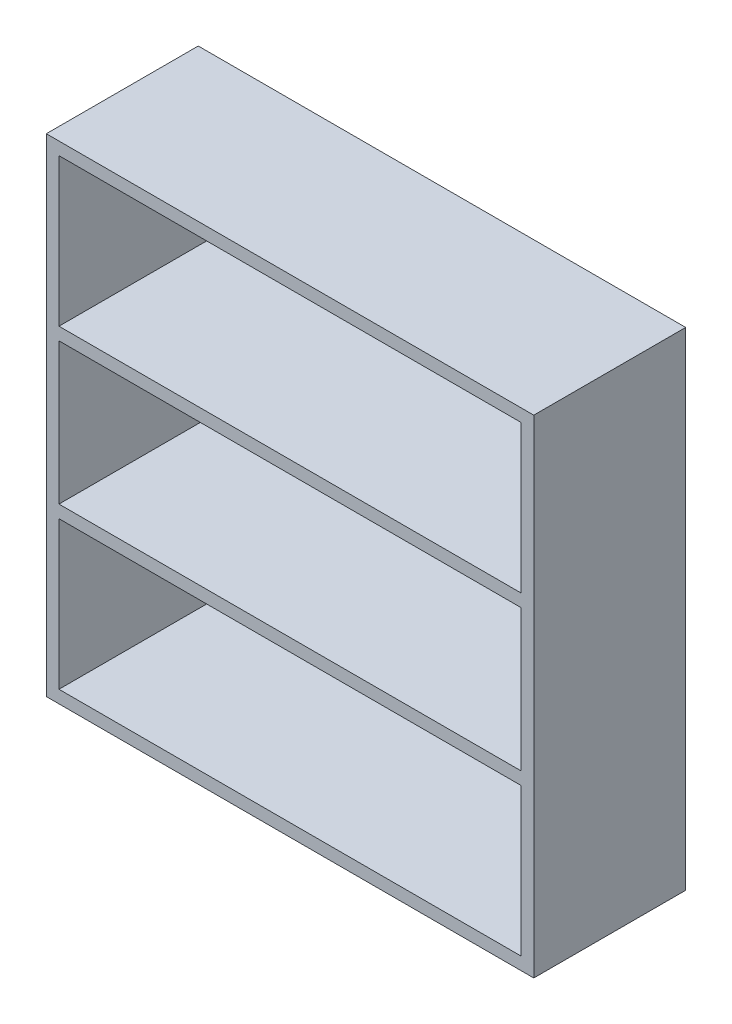
ISO-10303-21;
HEADER;
FILE_DESCRIPTION(('STEP AP214'),'2;1');
FILE_NAME('part.step','',(''),(''),'','','');
FILE_SCHEMA(('AUTOMOTIVE_DESIGN { 1 0 10303 214 1 1 1 1 }'));
ENDSEC;
DATA;
#1=APPLICATION_CONTEXT('core data for automotive mechanical design processes');
#2=APPLICATION_PROTOCOL_DEFINITION('international standard','automotive_design',2000,#1);
#3=PRODUCT_CONTEXT('',#1,'mechanical');
#4=PRODUCT('Part','Part','',(#3));
#5=PRODUCT_RELATED_PRODUCT_CATEGORY('part','',(#4));
#6=PRODUCT_DEFINITION_FORMATION('','',#4);
#7=PRODUCT_DEFINITION_CONTEXT('part definition',#1,'design');
#8=PRODUCT_DEFINITION('design','',#6,#7);
#9=PRODUCT_DEFINITION_SHAPE('','',#8);
#10=(LENGTH_UNIT() NAMED_UNIT(*) SI_UNIT(.MILLI.,.METRE.));
#11=(NAMED_UNIT(*) PLANE_ANGLE_UNIT() SI_UNIT($,.RADIAN.));
#12=(NAMED_UNIT(*) SI_UNIT($,.STERADIAN.) SOLID_ANGLE_UNIT());
#13=UNCERTAINTY_MEASURE_WITH_UNIT(LENGTH_MEASURE(1.E-05),#10,'distance_accuracy_value','');
#14=(GEOMETRIC_REPRESENTATION_CONTEXT(3) GLOBAL_UNCERTAINTY_ASSIGNED_CONTEXT((#13)) GLOBAL_UNIT_ASSIGNED_CONTEXT((#10,
#11,#12)) REPRESENTATION_CONTEXT('',''));
#15=CARTESIAN_POINT('',(0.,0.,0.));
#16=DIRECTION('',(0.,0.,1.));
#17=DIRECTION('',(1.,0.,0.));
#18=AXIS2_PLACEMENT_3D('',#15,#16,#17);
#19=CARTESIAN_POINT('',(977.9,1955.8,-304.8));
#20=DIRECTION('',(-1.,0.,0.));
#21=DIRECTION('',(0.,0.,1.));
#22=AXIS2_PLACEMENT_3D('',#19,#20,#21);
#23=PLANE('',#22);
#24=DIRECTION('',(0.,0.,-1.));
#25=VECTOR('',#24,1.);
#26=CARTESIAN_POINT('',(977.9,0.,-304.8));
#27=LINE('',#26,#25);
#28=CARTESIAN_POINT('',(977.9,0.,304.8));
#29=VERTEX_POINT('',#28);
#30=CARTESIAN_POINT('',(977.9,0.,-304.8));
#31=VERTEX_POINT('',#30);
#32=EDGE_CURVE('E182',#29,#31,#27,.T.);
#33=ORIENTED_EDGE('',*,*,#32,.T.);
#34=DIRECTION('',(0.,-1.,0.));
#35=VECTOR('',#34,1.);
#36=CARTESIAN_POINT('',(977.9,1955.8,-304.8));
#37=LINE('',#36,#35);
#38=CARTESIAN_POINT('',(977.9,1955.8,-304.8));
#39=VERTEX_POINT('',#38);
#40=EDGE_CURVE('E11',#39,#31,#37,.T.);
#41=ORIENTED_EDGE('',*,*,#40,.F.);
#42=DIRECTION('',(0.,0.,-1.));
#43=VECTOR('',#42,1.);
#44=CARTESIAN_POINT('',(977.9,1955.8,-304.8));
#45=LINE('',#44,#43);
#46=CARTESIAN_POINT('',(977.9,1955.8,304.8));
#47=VERTEX_POINT('',#46);
#48=EDGE_CURVE('E247',#47,#39,#45,.T.);
#49=ORIENTED_EDGE('',*,*,#48,.F.);
#50=DIRECTION('',(0.,-1.,0.));
#51=VECTOR('',#50,1.);
#52=CARTESIAN_POINT('',(977.9,1955.8,304.8));
#53=LINE('',#52,#51);
#54=EDGE_CURVE('E257',#47,#29,#53,.T.);
#55=ORIENTED_EDGE('',*,*,#54,.T.);
#56=EDGE_LOOP('',(#33,#41,#49,#55));
#57=FACE_BOUND('',#56,.T.);
#58=ADVANCED_FACE('F32',(#57),#23,.F.);
#59=CARTESIAN_POINT('',(-977.9,1955.8,-304.8));
#60=DIRECTION('',(0.,0.,1.));
#61=DIRECTION('',(1.,0.,0.));
#62=AXIS2_PLACEMENT_3D('',#59,#60,#61);
#63=PLANE('',#62);
#64=DIRECTION('',(-1.,0.,0.));
#65=VECTOR('',#64,1.);
#66=CARTESIAN_POINT('',(-927.099999999999,643.466666666667,-304.8));
#67=LINE('',#66,#65);
#68=CARTESIAN_POINT('',(927.1,643.466666666667,-304.8));
#69=VERTEX_POINT('',#68);
#70=CARTESIAN_POINT('',(-927.099999999999,643.466666666667,-304.8));
#71=VERTEX_POINT('',#70);
#72=EDGE_CURVE('E156',#69,#71,#67,.T.);
#73=ORIENTED_EDGE('',*,*,#72,.T.);
#74=DIRECTION('',(0.,-1.,0.));
#75=VECTOR('',#74,1.);
#76=CARTESIAN_POINT('',(-927.099999999999,643.466666666667,-304.8));
#77=LINE('',#76,#75);
#78=CARTESIAN_POINT('',(-927.1,50.8,-304.8));
#79=VERTEX_POINT('',#78);
#80=EDGE_CURVE('E148',#71,#79,#77,.T.);
#81=ORIENTED_EDGE('',*,*,#80,.T.);
#82=DIRECTION('',(1.,0.,0.));
#83=VECTOR('',#82,1.);
#84=CARTESIAN_POINT('',(-927.1,50.8,-304.8));
#85=LINE('',#84,#83);
#86=CARTESIAN_POINT('',(927.1,50.8,-304.8));
#87=VERTEX_POINT('',#86);
#88=EDGE_CURVE('E159',#79,#87,#85,.T.);
#89=ORIENTED_EDGE('',*,*,#88,.T.);
#90=DIRECTION('',(0.,1.,0.));
#91=VECTOR('',#90,1.);
#92=CARTESIAN_POINT('',(927.1,50.8,-304.8));
#93=LINE('',#92,#91);
#94=EDGE_CURVE('E46',#87,#69,#93,.T.);
#95=ORIENTED_EDGE('',*,*,#94,.T.);
#96=EDGE_LOOP('',(#73,#81,#89,#95));
#97=FACE_BOUND('',#96,.T.);
#98=DIRECTION('',(1.,0.,0.));
#99=VECTOR('',#98,1.);
#100=CARTESIAN_POINT('',(-927.1,1312.33333333333,-304.8));
#101=LINE('',#100,#99);
#102=CARTESIAN_POINT('',(-927.1,1312.33333333333,-304.8));
#103=VERTEX_POINT('',#102);
#104=CARTESIAN_POINT('',(927.1,1312.33333333333,-304.8));
#105=VERTEX_POINT('',#104);
#106=EDGE_CURVE('E194',#103,#105,#101,.T.);
#107=ORIENTED_EDGE('',*,*,#106,.T.);
#108=DIRECTION('',(0.,1.,0.));
#109=VECTOR('',#108,1.);
#110=CARTESIAN_POINT('',(927.1,1312.33333333333,-304.8));
#111=LINE('',#110,#109);
#112=CARTESIAN_POINT('',(927.1,1905.,-304.8));
#113=VERTEX_POINT('',#112);
#114=EDGE_CURVE('E186',#105,#113,#111,.T.);
#115=ORIENTED_EDGE('',*,*,#114,.T.);
#116=DIRECTION('',(-1.,0.,0.));
#117=VECTOR('',#116,1.);
#118=CARTESIAN_POINT('',(927.1,1905.,-304.8));
#119=LINE('',#118,#117);
#120=CARTESIAN_POINT('',(-927.1,1905.,-304.8));
#121=VERTEX_POINT('',#120);
#122=EDGE_CURVE('E189',#113,#121,#119,.T.);
#123=ORIENTED_EDGE('',*,*,#122,.T.);
#124=DIRECTION('',(0.,-1.,0.));
#125=VECTOR('',#124,1.);
#126=CARTESIAN_POINT('',(-927.1,1905.,-304.8));
#127=LINE('',#126,#125);
#128=EDGE_CURVE('E54',#121,#103,#127,.T.);
#129=ORIENTED_EDGE('',*,*,#128,.T.);
#130=EDGE_LOOP('',(#107,#115,#123,#129));
#131=FACE_BOUND('',#130,.T.);
#132=DIRECTION('',(-1.,0.,0.));
#133=VECTOR('',#132,1.);
#134=CARTESIAN_POINT('',(-927.1,1261.53333333333,-304.8));
#135=LINE('',#134,#133);
#136=CARTESIAN_POINT('',(927.1,1261.53333333333,-304.8));
#137=VERTEX_POINT('',#136);
#138=CARTESIAN_POINT('',(-927.1,1261.53333333333,-304.8));
#139=VERTEX_POINT('',#138);
#140=EDGE_CURVE('E226',#137,#139,#135,.T.);
#141=ORIENTED_EDGE('',*,*,#140,.T.);
#142=DIRECTION('',(0.,-1.,0.));
#143=VECTOR('',#142,1.);
#144=CARTESIAN_POINT('',(-927.1,1261.53333333333,-304.8));
#145=LINE('',#144,#143);
#146=CARTESIAN_POINT('',(-927.099999999999,694.266666666667,-304.8));
#147=VERTEX_POINT('',#146);
#148=EDGE_CURVE('E216',#139,#147,#145,.T.);
#149=ORIENTED_EDGE('',*,*,#148,.T.);
#150=DIRECTION('',(1.,0.,0.));
#151=VECTOR('',#150,1.);
#152=CARTESIAN_POINT('',(-927.099999999999,694.266666666667,-304.8));
#153=LINE('',#152,#151);
#154=CARTESIAN_POINT('',(927.1,694.266666666667,-304.8));
#155=VERTEX_POINT('',#154);
#156=EDGE_CURVE('E219',#147,#155,#153,.T.);
#157=ORIENTED_EDGE('',*,*,#156,.T.);
#158=DIRECTION('',(0.,1.,0.));
#159=VECTOR('',#158,1.);
#160=CARTESIAN_POINT('',(927.1,694.266666666667,-304.8));
#161=LINE('',#160,#159);
#162=EDGE_CURVE('E223',#155,#137,#161,.T.);
#163=ORIENTED_EDGE('',*,*,#162,.T.);
#164=EDGE_LOOP('',(#141,#149,#157,#163));
#165=FACE_BOUND('',#164,.T.);
#166=DIRECTION('',(-1.,0.,0.));
#167=VECTOR('',#166,1.);
#168=CARTESIAN_POINT('',(-977.9,0.,-304.8));
#169=LINE('',#168,#167);
#170=CARTESIAN_POINT('',(-977.9,0.,-304.8));
#171=VERTEX_POINT('',#170);
#172=EDGE_CURVE('E260',#31,#171,#169,.T.);
#173=ORIENTED_EDGE('',*,*,#172,.T.);
#174=DIRECTION('',(0.,-1.,0.));
#175=VECTOR('',#174,1.);
#176=CARTESIAN_POINT('',(-977.9,1955.8,-304.8));
#177=LINE('',#176,#175);
#178=CARTESIAN_POINT('',(-977.9,1955.8,-304.8));
#179=VERTEX_POINT('',#178);
#180=EDGE_CURVE('E39',#179,#171,#177,.T.);
#181=ORIENTED_EDGE('',*,*,#180,.F.);
#182=DIRECTION('',(-1.,0.,0.));
#183=VECTOR('',#182,1.);
#184=CARTESIAN_POINT('',(-977.9,1955.8,-304.8));
#185=LINE('',#184,#183);
#186=EDGE_CURVE('E250',#39,#179,#185,.T.);
#187=ORIENTED_EDGE('',*,*,#186,.F.);
#188=ORIENTED_EDGE('',*,*,#40,.T.);
#189=EDGE_LOOP('',(#173,#181,#187,#188));
#190=FACE_BOUND('',#189,.T.);
#191=ADVANCED_FACE('F163',(#97,#131,#165,#190),#63,.F.);
#192=CARTESIAN_POINT('',(-977.9,1955.8,-304.8));
#193=DIRECTION('',(1.,0.,0.));
#194=DIRECTION('',(0.,0.,-1.));
#195=AXIS2_PLACEMENT_3D('',#192,#193,#194);
#196=PLANE('',#195);
#197=DIRECTION('',(0.,0.,1.));
#198=VECTOR('',#197,1.);
#199=CARTESIAN_POINT('',(-977.9,0.,-304.8));
#200=LINE('',#199,#198);
#201=CARTESIAN_POINT('',(-977.9,0.,304.8));
#202=VERTEX_POINT('',#201);
#203=EDGE_CURVE('E262',#171,#202,#200,.T.);
#204=ORIENTED_EDGE('',*,*,#203,.T.);
#205=DIRECTION('',(0.,-1.,0.));
#206=VECTOR('',#205,1.);
#207=CARTESIAN_POINT('',(-977.9,1955.8,304.8));
#208=LINE('',#207,#206);
#209=CARTESIAN_POINT('',(-977.9,1955.8,304.8));
#210=VERTEX_POINT('',#209);
#211=EDGE_CURVE('E267',#210,#202,#208,.T.);
#212=ORIENTED_EDGE('',*,*,#211,.F.);
#213=DIRECTION('',(0.,0.,1.));
#214=VECTOR('',#213,1.);
#215=CARTESIAN_POINT('',(-977.9,1955.8,-304.8));
#216=LINE('',#215,#214);
#217=EDGE_CURVE('E253',#179,#210,#216,.T.);
#218=ORIENTED_EDGE('',*,*,#217,.F.);
#219=ORIENTED_EDGE('',*,*,#180,.T.);
#220=EDGE_LOOP('',(#204,#212,#218,#219));
#221=FACE_BOUND('',#220,.T.);
#222=ADVANCED_FACE('F274',(#221),#196,.F.);
#223=CARTESIAN_POINT('',(-977.9,1955.8,304.8));
#224=DIRECTION('',(0.,0.,-1.));
#225=DIRECTION('',(-1.,0.,0.));
#226=AXIS2_PLACEMENT_3D('',#223,#224,#225);
#227=PLANE('',#226);
#228=DIRECTION('',(1.,0.,0.));
#229=VECTOR('',#228,1.);
#230=CARTESIAN_POINT('',(-927.1,50.8,304.8));
#231=LINE('',#230,#229);
#232=CARTESIAN_POINT('',(-927.1,50.8,304.8));
#233=VERTEX_POINT('',#232);
#234=CARTESIAN_POINT('',(927.1,50.8,304.8));
#235=VERTEX_POINT('',#234);
#236=EDGE_CURVE('E175',#233,#235,#231,.T.);
#237=ORIENTED_EDGE('',*,*,#236,.F.);
#238=DIRECTION('',(0.,-1.,0.));
#239=VECTOR('',#238,1.);
#240=CARTESIAN_POINT('',(-927.099999999999,643.466666666667,304.8));
#241=LINE('',#240,#239);
#242=CARTESIAN_POINT('',(-927.099999999999,643.466666666667,304.8));
#243=VERTEX_POINT('',#242);
#244=EDGE_CURVE('E151',#243,#233,#241,.T.);
#245=ORIENTED_EDGE('',*,*,#244,.F.);
#246=DIRECTION('',(-1.,0.,0.));
#247=VECTOR('',#246,1.);
#248=CARTESIAN_POINT('',(-927.099999999999,643.466666666667,304.8));
#249=LINE('',#248,#247);
#250=CARTESIAN_POINT('',(927.1,643.466666666667,304.8));
#251=VERTEX_POINT('',#250);
#252=EDGE_CURVE('E166',#251,#243,#249,.T.);
#253=ORIENTED_EDGE('',*,*,#252,.F.);
#254=DIRECTION('',(0.,1.,0.));
#255=VECTOR('',#254,1.);
#256=CARTESIAN_POINT('',(927.1,50.8,304.8));
#257=LINE('',#256,#255);
#258=EDGE_CURVE('E169',#235,#251,#257,.T.);
#259=ORIENTED_EDGE('',*,*,#258,.F.);
#260=EDGE_LOOP('',(#237,#245,#253,#259));
#261=FACE_BOUND('',#260,.T.);
#262=DIRECTION('',(-1.,0.,0.));
#263=VECTOR('',#262,1.);
#264=CARTESIAN_POINT('',(927.1,1905.,304.8));
#265=LINE('',#264,#263);
#266=CARTESIAN_POINT('',(927.1,1905.,304.8));
#267=VERTEX_POINT('',#266);
#268=CARTESIAN_POINT('',(-927.1,1905.,304.8));
#269=VERTEX_POINT('',#268);
#270=EDGE_CURVE('E200',#267,#269,#265,.T.);
#271=ORIENTED_EDGE('',*,*,#270,.F.);
#272=DIRECTION('',(0.,1.,0.));
#273=VECTOR('',#272,1.);
#274=CARTESIAN_POINT('',(927.1,1312.33333333333,304.8));
#275=LINE('',#274,#273);
#276=CARTESIAN_POINT('',(927.1,1312.33333333333,304.8));
#277=VERTEX_POINT('',#276);
#278=EDGE_CURVE('E198',#277,#267,#275,.T.);
#279=ORIENTED_EDGE('',*,*,#278,.F.);
#280=DIRECTION('',(1.,0.,0.));
#281=VECTOR('',#280,1.);
#282=CARTESIAN_POINT('',(-927.1,1312.33333333333,304.8));
#283=LINE('',#282,#281);
#284=CARTESIAN_POINT('',(-927.1,1312.33333333333,304.8));
#285=VERTEX_POINT('',#284);
#286=EDGE_CURVE('E190',#285,#277,#283,.T.);
#287=ORIENTED_EDGE('',*,*,#286,.F.);
#288=DIRECTION('',(0.,-1.,0.));
#289=VECTOR('',#288,1.);
#290=CARTESIAN_POINT('',(-927.1,1905.,304.8));
#291=LINE('',#290,#289);
#292=EDGE_CURVE('E204',#269,#285,#291,.T.);
#293=ORIENTED_EDGE('',*,*,#292,.F.);
#294=EDGE_LOOP('',(#271,#279,#287,#293));
#295=FACE_BOUND('',#294,.T.);
#296=DIRECTION('',(1.,0.,0.));
#297=VECTOR('',#296,1.);
#298=CARTESIAN_POINT('',(-927.099999999999,694.266666666667,304.8));
#299=LINE('',#298,#297);
#300=CARTESIAN_POINT('',(-927.099999999999,694.266666666667,304.8));
#301=VERTEX_POINT('',#300);
#302=CARTESIAN_POINT('',(927.1,694.266666666667,304.8));
#303=VERTEX_POINT('',#302);
#304=EDGE_CURVE('E232',#301,#303,#299,.T.);
#305=ORIENTED_EDGE('',*,*,#304,.F.);
#306=DIRECTION('',(0.,-1.,0.));
#307=VECTOR('',#306,1.);
#308=CARTESIAN_POINT('',(-927.1,1261.53333333333,304.8));
#309=LINE('',#308,#307);
#310=CARTESIAN_POINT('',(-927.1,1261.53333333333,304.8));
#311=VERTEX_POINT('',#310);
#312=EDGE_CURVE('E230',#311,#301,#309,.T.);
#313=ORIENTED_EDGE('',*,*,#312,.F.);
#314=DIRECTION('',(-1.,0.,0.));
#315=VECTOR('',#314,1.);
#316=CARTESIAN_POINT('',(-927.1,1261.53333333333,304.8));
#317=LINE('',#316,#315);
#318=CARTESIAN_POINT('',(927.1,1261.53333333333,304.8));
#319=VERTEX_POINT('',#318);
#320=EDGE_CURVE('E220',#319,#311,#317,.T.);
#321=ORIENTED_EDGE('',*,*,#320,.F.);
#322=DIRECTION('',(0.,1.,0.));
#323=VECTOR('',#322,1.);
#324=CARTESIAN_POINT('',(927.1,694.266666666667,304.8));
#325=LINE('',#324,#323);
#326=EDGE_CURVE('E235',#303,#319,#325,.T.);
#327=ORIENTED_EDGE('',*,*,#326,.F.);
#328=EDGE_LOOP('',(#305,#313,#321,#327));
#329=FACE_BOUND('',#328,.T.);
#330=DIRECTION('',(1.,0.,0.));
#331=VECTOR('',#330,1.);
#332=CARTESIAN_POINT('',(-977.9,0.,304.8));
#333=LINE('',#332,#331);
#334=EDGE_CURVE('E251',#202,#29,#333,.T.);
#335=ORIENTED_EDGE('',*,*,#334,.T.);
#336=ORIENTED_EDGE('',*,*,#54,.F.);
#337=DIRECTION('',(1.,0.,0.));
#338=VECTOR('',#337,1.);
#339=CARTESIAN_POINT('',(-977.9,1955.8,304.8));
#340=LINE('',#339,#338);
#341=EDGE_CURVE('E255',#210,#47,#340,.T.);
#342=ORIENTED_EDGE('',*,*,#341,.F.);
#343=ORIENTED_EDGE('',*,*,#211,.T.);
#344=EDGE_LOOP('',(#335,#336,#342,#343));
#345=FACE_BOUND('',#344,.T.);
#346=ADVANCED_FACE('F283',(#261,#295,#329,#345),#227,.F.);
#347=CARTESIAN_POINT('',(0.,1955.8,0.));
#348=DIRECTION('',(0.,1.,0.));
#349=DIRECTION('',(0.,0.,1.));
#350=AXIS2_PLACEMENT_3D('',#347,#348,#349);
#351=PLANE('',#350);
#352=ORIENTED_EDGE('',*,*,#48,.T.);
#353=ORIENTED_EDGE('',*,*,#186,.T.);
#354=ORIENTED_EDGE('',*,*,#217,.T.);
#355=ORIENTED_EDGE('',*,*,#341,.T.);
#356=EDGE_LOOP('',(#352,#353,#354,#355));
#357=FACE_BOUND('',#356,.T.);
#358=ADVANCED_FACE('F289',(#357),#351,.T.);
#359=CARTESIAN_POINT('',(0.,0.,0.));
#360=DIRECTION('',(0.,1.,0.));
#361=DIRECTION('',(0.,0.,1.));
#362=AXIS2_PLACEMENT_3D('',#359,#360,#361);
#363=PLANE('',#362);
#364=ORIENTED_EDGE('',*,*,#32,.F.);
#365=ORIENTED_EDGE('',*,*,#334,.F.);
#366=ORIENTED_EDGE('',*,*,#203,.F.);
#367=ORIENTED_EDGE('',*,*,#172,.F.);
#368=EDGE_LOOP('',(#364,#365,#366,#367));
#369=FACE_BOUND('',#368,.T.);
#370=ADVANCED_FACE('F280',(#369),#363,.F.);
#371=CARTESIAN_POINT('',(-927.1,1261.53333333333,-304.8));
#372=DIRECTION('',(-1.,0.,0.));
#373=DIRECTION('',(0.,-1.,0.));
#374=AXIS2_PLACEMENT_3D('',#371,#372,#373);
#375=PLANE('',#374);
#376=ORIENTED_EDGE('',*,*,#312,.T.);
#377=DIRECTION('',(0.,0.,1.));
#378=VECTOR('',#377,1.);
#379=CARTESIAN_POINT('',(-927.099999999999,694.266666666667,-304.8));
#380=LINE('',#379,#378);
#381=EDGE_CURVE('E229',#147,#301,#380,.T.);
#382=ORIENTED_EDGE('',*,*,#381,.F.);
#383=ORIENTED_EDGE('',*,*,#148,.F.);
#384=DIRECTION('',(0.,0.,1.));
#385=VECTOR('',#384,1.);
#386=CARTESIAN_POINT('',(-927.1,1261.53333333333,-304.8));
#387=LINE('',#386,#385);
#388=EDGE_CURVE('E201',#139,#311,#387,.T.);
#389=ORIENTED_EDGE('',*,*,#388,.T.);
#390=EDGE_LOOP('',(#376,#382,#383,#389));
#391=FACE_BOUND('',#390,.T.);
#392=ADVANCED_FACE('F302',(#391),#375,.F.);
#393=CARTESIAN_POINT('',(-927.1,1261.53333333333,-304.8));
#394=DIRECTION('',(0.,1.,0.));
#395=DIRECTION('',(0.,0.,1.));
#396=AXIS2_PLACEMENT_3D('',#393,#394,#395);
#397=PLANE('',#396);
#398=ORIENTED_EDGE('',*,*,#320,.T.);
#399=ORIENTED_EDGE('',*,*,#388,.F.);
#400=ORIENTED_EDGE('',*,*,#140,.F.);
#401=DIRECTION('',(0.,0.,1.));
#402=VECTOR('',#401,1.);
#403=CARTESIAN_POINT('',(927.1,1261.53333333333,-304.8));
#404=LINE('',#403,#402);
#405=EDGE_CURVE('E241',#137,#319,#404,.T.);
#406=ORIENTED_EDGE('',*,*,#405,.T.);
#407=EDGE_LOOP('',(#398,#399,#400,#406));
#408=FACE_BOUND('',#407,.T.);
#409=ADVANCED_FACE('F307',(#408),#397,.F.);
#410=CARTESIAN_POINT('',(927.1,694.266666666667,-304.8));
#411=DIRECTION('',(1.,0.,0.));
#412=DIRECTION('',(0.,1.,0.));
#413=AXIS2_PLACEMENT_3D('',#410,#411,#412);
#414=PLANE('',#413);
#415=ORIENTED_EDGE('',*,*,#326,.T.);
#416=ORIENTED_EDGE('',*,*,#405,.F.);
#417=ORIENTED_EDGE('',*,*,#162,.F.);
#418=DIRECTION('',(0.,0.,1.));
#419=VECTOR('',#418,1.);
#420=CARTESIAN_POINT('',(927.1,694.266666666667,-304.8));
#421=LINE('',#420,#419);
#422=EDGE_CURVE('E243',#155,#303,#421,.T.);
#423=ORIENTED_EDGE('',*,*,#422,.T.);
#424=EDGE_LOOP('',(#415,#416,#417,#423));
#425=FACE_BOUND('',#424,.T.);
#426=ADVANCED_FACE('F313',(#425),#414,.F.);
#427=CARTESIAN_POINT('',(-927.099999999999,694.266666666667,-304.8));
#428=DIRECTION('',(0.,-1.,0.));
#429=DIRECTION('',(0.,0.,-1.));
#430=AXIS2_PLACEMENT_3D('',#427,#428,#429);
#431=PLANE('',#430);
#432=ORIENTED_EDGE('',*,*,#304,.T.);
#433=ORIENTED_EDGE('',*,*,#422,.F.);
#434=ORIENTED_EDGE('',*,*,#156,.F.);
#435=ORIENTED_EDGE('',*,*,#381,.T.);
#436=EDGE_LOOP('',(#432,#433,#434,#435));
#437=FACE_BOUND('',#436,.T.);
#438=ADVANCED_FACE('F309',(#437),#431,.F.);
#439=CARTESIAN_POINT('',(927.1,1312.33333333333,-304.8));
#440=DIRECTION('',(1.,0.,0.));
#441=DIRECTION('',(0.,1.,0.));
#442=AXIS2_PLACEMENT_3D('',#439,#440,#441);
#443=PLANE('',#442);
#444=ORIENTED_EDGE('',*,*,#278,.T.);
#445=DIRECTION('',(0.,0.,1.));
#446=VECTOR('',#445,1.);
#447=CARTESIAN_POINT('',(927.1,1905.,-304.8));
#448=LINE('',#447,#446);
#449=EDGE_CURVE('E197',#113,#267,#448,.T.);
#450=ORIENTED_EDGE('',*,*,#449,.F.);
#451=ORIENTED_EDGE('',*,*,#114,.F.);
#452=DIRECTION('',(0.,0.,1.));
#453=VECTOR('',#452,1.);
#454=CARTESIAN_POINT('',(927.1,1312.33333333333,-304.8));
#455=LINE('',#454,#453);
#456=EDGE_CURVE('E176',#105,#277,#455,.T.);
#457=ORIENTED_EDGE('',*,*,#456,.T.);
#458=EDGE_LOOP('',(#444,#450,#451,#457));
#459=FACE_BOUND('',#458,.T.);
#460=ADVANCED_FACE('F312',(#459),#443,.F.);
#461=CARTESIAN_POINT('',(-927.1,1312.33333333333,-304.8));
#462=DIRECTION('',(0.,-1.,0.));
#463=DIRECTION('',(0.,0.,-1.));
#464=AXIS2_PLACEMENT_3D('',#461,#462,#463);
#465=PLANE('',#464);
#466=ORIENTED_EDGE('',*,*,#286,.T.);
#467=ORIENTED_EDGE('',*,*,#456,.F.);
#468=ORIENTED_EDGE('',*,*,#106,.F.);
#469=DIRECTION('',(0.,0.,1.));
#470=VECTOR('',#469,1.);
#471=CARTESIAN_POINT('',(-927.1,1312.33333333333,-304.8));
#472=LINE('',#471,#470);
#473=EDGE_CURVE('E210',#103,#285,#472,.T.);
#474=ORIENTED_EDGE('',*,*,#473,.T.);
#475=EDGE_LOOP('',(#466,#467,#468,#474));
#476=FACE_BOUND('',#475,.T.);
#477=ADVANCED_FACE('F323',(#476),#465,.F.);
#478=CARTESIAN_POINT('',(-927.1,1905.,-304.8));
#479=DIRECTION('',(-1.,0.,0.));
#480=DIRECTION('',(0.,0.,1.));
#481=AXIS2_PLACEMENT_3D('',#478,#479,#480);
#482=PLANE('',#481);
#483=ORIENTED_EDGE('',*,*,#292,.T.);
#484=ORIENTED_EDGE('',*,*,#473,.F.);
#485=ORIENTED_EDGE('',*,*,#128,.F.);
#486=DIRECTION('',(0.,0.,1.));
#487=VECTOR('',#486,1.);
#488=CARTESIAN_POINT('',(-927.1,1905.,-304.8));
#489=LINE('',#488,#487);
#490=EDGE_CURVE('E212',#121,#269,#489,.T.);
#491=ORIENTED_EDGE('',*,*,#490,.T.);
#492=EDGE_LOOP('',(#483,#484,#485,#491));
#493=FACE_BOUND('',#492,.T.);
#494=ADVANCED_FACE('F328',(#493),#482,.F.);
#495=CARTESIAN_POINT('',(927.1,1905.,-304.8));
#496=DIRECTION('',(0.,1.,0.));
#497=DIRECTION('',(0.,0.,1.));
#498=AXIS2_PLACEMENT_3D('',#495,#496,#497);
#499=PLANE('',#498);
#500=ORIENTED_EDGE('',*,*,#270,.T.);
#501=ORIENTED_EDGE('',*,*,#490,.F.);
#502=ORIENTED_EDGE('',*,*,#122,.F.);
#503=ORIENTED_EDGE('',*,*,#449,.T.);
#504=EDGE_LOOP('',(#500,#501,#502,#503));
#505=FACE_BOUND('',#504,.T.);
#506=ADVANCED_FACE('F325',(#505),#499,.F.);
#507=CARTESIAN_POINT('',(-927.099999999999,643.466666666667,-304.8));
#508=DIRECTION('',(-1.,0.,0.));
#509=DIRECTION('',(0.,-1.,0.));
#510=AXIS2_PLACEMENT_3D('',#507,#508,#509);
#511=PLANE('',#510);
#512=ORIENTED_EDGE('',*,*,#244,.T.);
#513=DIRECTION('',(0.,0.,1.));
#514=VECTOR('',#513,1.);
#515=CARTESIAN_POINT('',(-927.1,50.8,-304.8));
#516=LINE('',#515,#514);
#517=EDGE_CURVE('E144',#79,#233,#516,.T.);
#518=ORIENTED_EDGE('',*,*,#517,.F.);
#519=ORIENTED_EDGE('',*,*,#80,.F.);
#520=DIRECTION('',(0.,0.,1.));
#521=VECTOR('',#520,1.);
#522=CARTESIAN_POINT('',(-927.099999999999,643.466666666667,-304.8));
#523=LINE('',#522,#521);
#524=EDGE_CURVE('E180',#71,#243,#523,.T.);
#525=ORIENTED_EDGE('',*,*,#524,.T.);
#526=EDGE_LOOP('',(#512,#518,#519,#525));
#527=FACE_BOUND('',#526,.T.);
#528=ADVANCED_FACE('F146',(#527),#511,.F.);
#529=CARTESIAN_POINT('',(-927.099999999999,643.466666666667,-304.8));
#530=DIRECTION('',(0.,1.,0.));
#531=DIRECTION('',(0.,0.,1.));
#532=AXIS2_PLACEMENT_3D('',#529,#530,#531);
#533=PLANE('',#532);
#534=ORIENTED_EDGE('',*,*,#252,.T.);
#535=ORIENTED_EDGE('',*,*,#524,.F.);
#536=ORIENTED_EDGE('',*,*,#72,.F.);
#537=DIRECTION('',(0.,0.,1.));
#538=VECTOR('',#537,1.);
#539=CARTESIAN_POINT('',(927.1,643.466666666667,-304.8));
#540=LINE('',#539,#538);
#541=EDGE_CURVE('E183',#69,#251,#540,.T.);
#542=ORIENTED_EDGE('',*,*,#541,.T.);
#543=EDGE_LOOP('',(#534,#535,#536,#542));
#544=FACE_BOUND('',#543,.T.);
#545=ADVANCED_FACE('F337',(#544),#533,.F.);
#546=CARTESIAN_POINT('',(927.1,50.8,-304.8));
#547=DIRECTION('',(1.,0.,0.));
#548=DIRECTION('',(0.,1.,0.));
#549=AXIS2_PLACEMENT_3D('',#546,#547,#548);
#550=PLANE('',#549);
#551=ORIENTED_EDGE('',*,*,#258,.T.);
#552=ORIENTED_EDGE('',*,*,#541,.F.);
#553=ORIENTED_EDGE('',*,*,#94,.F.);
#554=DIRECTION('',(0.,0.,1.));
#555=VECTOR('',#554,1.);
#556=CARTESIAN_POINT('',(927.1,50.8,-304.8));
#557=LINE('',#556,#555);
#558=EDGE_CURVE('E155',#87,#235,#557,.T.);
#559=ORIENTED_EDGE('',*,*,#558,.T.);
#560=EDGE_LOOP('',(#551,#552,#553,#559));
#561=FACE_BOUND('',#560,.T.);
#562=ADVANCED_FACE('F340',(#561),#550,.F.);
#563=CARTESIAN_POINT('',(-927.1,50.8,-304.8));
#564=DIRECTION('',(0.,-1.,0.));
#565=DIRECTION('',(0.,0.,-1.));
#566=AXIS2_PLACEMENT_3D('',#563,#564,#565);
#567=PLANE('',#566);
#568=ORIENTED_EDGE('',*,*,#236,.T.);
#569=ORIENTED_EDGE('',*,*,#558,.F.);
#570=ORIENTED_EDGE('',*,*,#88,.F.);
#571=ORIENTED_EDGE('',*,*,#517,.T.);
#572=EDGE_LOOP('',(#568,#569,#570,#571));
#573=FACE_BOUND('',#572,.T.);
#574=ADVANCED_FACE('F160',(#573),#567,.F.);
#575=CLOSED_SHELL('',(#58,#191,#222,#346,#358,#370,#392,#409,#426,#438,#460,#477,#494,#506,#528,
#545,#562,#574));
#576=MANIFOLD_SOLID_BREP('B2',#575);
#577=ADVANCED_BREP_SHAPE_REPRESENTATION('',(#18,#576),#14);
#578=SHAPE_DEFINITION_REPRESENTATION(#9,#577);
ENDSEC;
END-ISO-10303-21;
